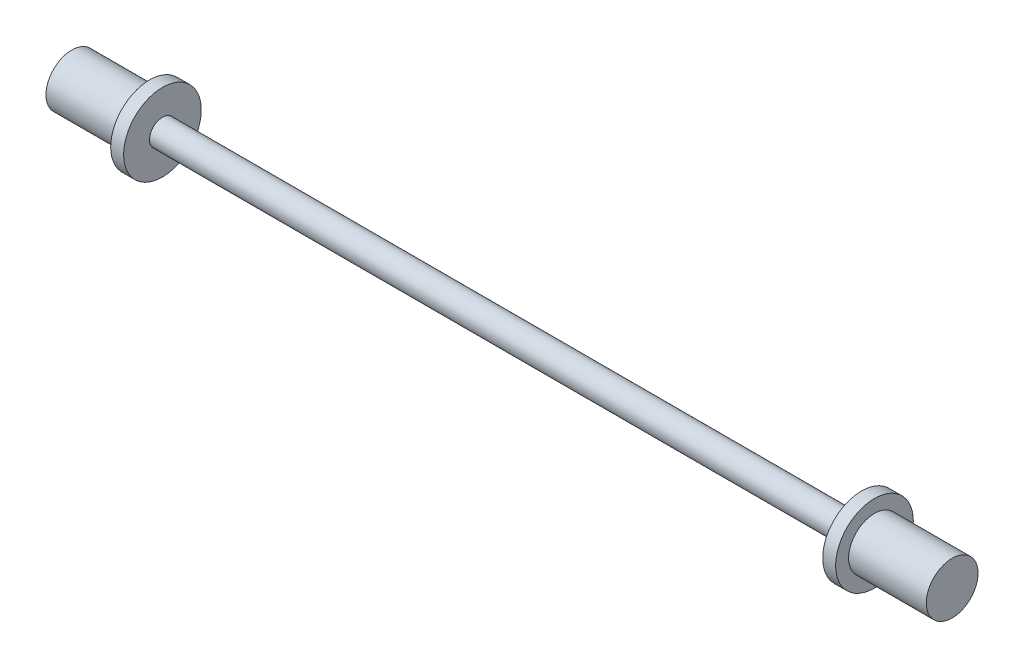
ISO-10303-21;
HEADER;
FILE_DESCRIPTION(('STEP AP214'),'2;1');
FILE_NAME('part.step','',(''),(''),'','','');
FILE_SCHEMA(('AUTOMOTIVE_DESIGN { 1 0 10303 214 1 1 1 1 }'));
ENDSEC;
DATA;
#1=APPLICATION_CONTEXT('core data for automotive mechanical design processes');
#2=APPLICATION_PROTOCOL_DEFINITION('international standard','automotive_design',2000,#1);
#3=PRODUCT_CONTEXT('',#1,'mechanical');
#4=PRODUCT('Part','Part','',(#3));
#5=PRODUCT_RELATED_PRODUCT_CATEGORY('part','',(#4));
#6=PRODUCT_DEFINITION_FORMATION('','',#4);
#7=PRODUCT_DEFINITION_CONTEXT('part definition',#1,'design');
#8=PRODUCT_DEFINITION('design','',#6,#7);
#9=PRODUCT_DEFINITION_SHAPE('','',#8);
#10=(LENGTH_UNIT() NAMED_UNIT(*) SI_UNIT(.MILLI.,.METRE.));
#11=(NAMED_UNIT(*) PLANE_ANGLE_UNIT() SI_UNIT($,.RADIAN.));
#12=(NAMED_UNIT(*) SI_UNIT($,.STERADIAN.) SOLID_ANGLE_UNIT());
#13=UNCERTAINTY_MEASURE_WITH_UNIT(LENGTH_MEASURE(1.E-05),#10,'distance_accuracy_value','');
#14=(GEOMETRIC_REPRESENTATION_CONTEXT(3) GLOBAL_UNCERTAINTY_ASSIGNED_CONTEXT((#13)) GLOBAL_UNIT_ASSIGNED_CONTEXT((#10,
#11,#12)) REPRESENTATION_CONTEXT('',''));
#15=CARTESIAN_POINT('',(0.,0.,0.));
#16=DIRECTION('',(0.,0.,1.));
#17=DIRECTION('',(1.,0.,0.));
#18=AXIS2_PLACEMENT_3D('',#15,#16,#17);
#19=CARTESIAN_POINT('',(-171.45,0.,0.));
#20=DIRECTION('',(1.,0.,0.));
#21=DIRECTION('',(0.,0.,-1.));
#22=AXIS2_PLACEMENT_3D('',#19,#20,#21);
#23=CYLINDRICAL_SURFACE('',#22,6.35);
#24=CARTESIAN_POINT('',(-171.45,0.,0.));
#25=DIRECTION('',(1.,0.,0.));
#26=DIRECTION('',(0.,0.,-1.));
#27=AXIS2_PLACEMENT_3D('',#24,#25,#26);
#28=CIRCLE('',#27,6.35);
#29=CARTESIAN_POINT('',(-171.45,0.,-6.35));
#30=VERTEX_POINT('',#29);
#31=EDGE_CURVE('E39',#30,#30,#28,.T.);
#32=ORIENTED_EDGE('',*,*,#31,.T.);
#33=EDGE_LOOP('',(#32));
#34=FACE_BOUND('',#33,.T.);
#35=CARTESIAN_POINT('',(171.45,0.,0.));
#36=DIRECTION('',(1.,0.,0.));
#37=DIRECTION('',(0.,0.,-1.));
#38=AXIS2_PLACEMENT_3D('',#35,#36,#37);
#39=CIRCLE('',#38,6.35);
#40=CARTESIAN_POINT('',(171.45,0.,-6.35));
#41=VERTEX_POINT('',#40);
#42=EDGE_CURVE('E48',#41,#41,#39,.T.);
#43=ORIENTED_EDGE('',*,*,#42,.F.);
#44=EDGE_LOOP('',(#43));
#45=FACE_BOUND('',#44,.T.);
#46=ADVANCED_FACE('F36',(#34,#45),#23,.T.);
#47=CARTESIAN_POINT('',(177.8,0.,0.));
#48=DIRECTION('',(-1.,0.,0.));
#49=DIRECTION('',(0.,0.,1.));
#50=AXIS2_PLACEMENT_3D('',#47,#48,#49);
#51=CYLINDRICAL_SURFACE('',#50,19.05);
#52=CARTESIAN_POINT('',(177.8,0.,0.));
#53=DIRECTION('',(1.,0.,0.));
#54=DIRECTION('',(0.,0.,-1.));
#55=AXIS2_PLACEMENT_3D('',#52,#53,#54);
#56=CIRCLE('',#55,19.05);
#57=CARTESIAN_POINT('',(177.8,0.,-19.05));
#58=VERTEX_POINT('',#57);
#59=EDGE_CURVE('E62',#58,#58,#56,.T.);
#60=ORIENTED_EDGE('',*,*,#59,.F.);
#61=EDGE_LOOP('',(#60));
#62=FACE_BOUND('',#61,.T.);
#63=CARTESIAN_POINT('',(171.45,0.,0.));
#64=DIRECTION('',(1.,0.,0.));
#65=DIRECTION('',(0.,0.,-1.));
#66=AXIS2_PLACEMENT_3D('',#63,#64,#65);
#67=CIRCLE('',#66,19.05);
#68=CARTESIAN_POINT('',(171.45,0.,-19.05));
#69=VERTEX_POINT('',#68);
#70=EDGE_CURVE('E65',#69,#69,#67,.T.);
#71=ORIENTED_EDGE('',*,*,#70,.T.);
#72=EDGE_LOOP('',(#71));
#73=FACE_BOUND('',#72,.T.);
#74=ADVANCED_FACE('F74',(#62,#73),#51,.T.);
#75=CARTESIAN_POINT('',(177.8,0.,0.));
#76=DIRECTION('',(1.,0.,0.));
#77=DIRECTION('',(0.,0.,-1.));
#78=AXIS2_PLACEMENT_3D('',#75,#76,#77);
#79=PLANE('',#78);
#80=CARTESIAN_POINT('',(177.8,0.,0.));
#81=DIRECTION('',(1.,0.,0.));
#82=DIRECTION('',(0.,0.,-1.));
#83=AXIS2_PLACEMENT_3D('',#80,#81,#82);
#84=CIRCLE('',#83,12.7);
#85=CARTESIAN_POINT('',(177.8,0.,12.7));
#86=VERTEX_POINT('',#85);
#87=EDGE_CURVE('E10',#86,#86,#84,.T.);
#88=ORIENTED_EDGE('',*,*,#87,.F.);
#89=EDGE_LOOP('',(#88));
#90=FACE_BOUND('',#89,.T.);
#91=ORIENTED_EDGE('',*,*,#59,.T.);
#92=EDGE_LOOP('',(#91));
#93=FACE_BOUND('',#92,.T.);
#94=ADVANCED_FACE('F79',(#90,#93),#79,.T.);
#95=CARTESIAN_POINT('',(171.45,0.,0.));
#96=DIRECTION('',(1.,0.,0.));
#97=DIRECTION('',(0.,0.,-1.));
#98=AXIS2_PLACEMENT_3D('',#95,#96,#97);
#99=PLANE('',#98);
#100=ORIENTED_EDGE('',*,*,#42,.T.);
#101=EDGE_LOOP('',(#100));
#102=FACE_BOUND('',#101,.T.);
#103=ORIENTED_EDGE('',*,*,#70,.F.);
#104=EDGE_LOOP('',(#103));
#105=FACE_BOUND('',#104,.T.);
#106=ADVANCED_FACE('F70',(#102,#105),#99,.F.);
#107=CARTESIAN_POINT('',(-177.8,0.,0.));
#108=DIRECTION('',(1.,0.,0.));
#109=DIRECTION('',(0.,0.,-1.));
#110=AXIS2_PLACEMENT_3D('',#107,#108,#109);
#111=CYLINDRICAL_SURFACE('',#110,19.05);
#112=CARTESIAN_POINT('',(-177.8,0.,0.));
#113=DIRECTION('',(-1.,0.,0.));
#114=DIRECTION('',(0.,0.,1.));
#115=AXIS2_PLACEMENT_3D('',#112,#113,#114);
#116=CIRCLE('',#115,19.05);
#117=CARTESIAN_POINT('',(-177.8,0.,19.05));
#118=VERTEX_POINT('',#117);
#119=EDGE_CURVE('E57',#118,#118,#116,.T.);
#120=ORIENTED_EDGE('',*,*,#119,.F.);
#121=EDGE_LOOP('',(#120));
#122=FACE_BOUND('',#121,.T.);
#123=CARTESIAN_POINT('',(-171.45,0.,0.));
#124=DIRECTION('',(-1.,0.,0.));
#125=DIRECTION('',(0.,0.,1.));
#126=AXIS2_PLACEMENT_3D('',#123,#124,#125);
#127=CIRCLE('',#126,19.05);
#128=CARTESIAN_POINT('',(-171.45,0.,19.05));
#129=VERTEX_POINT('',#128);
#130=EDGE_CURVE('E55',#129,#129,#127,.T.);
#131=ORIENTED_EDGE('',*,*,#130,.T.);
#132=EDGE_LOOP('',(#131));
#133=FACE_BOUND('',#132,.T.);
#134=ADVANCED_FACE('F92',(#122,#133),#111,.T.);
#135=CARTESIAN_POINT('',(-177.8,0.,0.));
#136=DIRECTION('',(-1.,0.,0.));
#137=DIRECTION('',(0.,0.,1.));
#138=AXIS2_PLACEMENT_3D('',#135,#136,#137);
#139=PLANE('',#138);
#140=CARTESIAN_POINT('',(-177.8,0.,0.));
#141=DIRECTION('',(-1.,0.,0.));
#142=DIRECTION('',(0.,0.,1.));
#143=AXIS2_PLACEMENT_3D('',#140,#141,#142);
#144=CIRCLE('',#143,12.7);
#145=CARTESIAN_POINT('',(-177.8,0.,-12.7));
#146=VERTEX_POINT('',#145);
#147=EDGE_CURVE('E43',#146,#146,#144,.T.);
#148=ORIENTED_EDGE('',*,*,#147,.F.);
#149=EDGE_LOOP('',(#148));
#150=FACE_BOUND('',#149,.T.);
#151=ORIENTED_EDGE('',*,*,#119,.T.);
#152=EDGE_LOOP('',(#151));
#153=FACE_BOUND('',#152,.T.);
#154=ADVANCED_FACE('F88',(#150,#153),#139,.T.);
#155=CARTESIAN_POINT('',(-171.45,0.,0.));
#156=DIRECTION('',(-1.,0.,0.));
#157=DIRECTION('',(0.,0.,1.));
#158=AXIS2_PLACEMENT_3D('',#155,#156,#157);
#159=PLANE('',#158);
#160=ORIENTED_EDGE('',*,*,#31,.F.);
#161=EDGE_LOOP('',(#160));
#162=FACE_BOUND('',#161,.T.);
#163=ORIENTED_EDGE('',*,*,#130,.F.);
#164=EDGE_LOOP('',(#163));
#165=FACE_BOUND('',#164,.T.);
#166=ADVANCED_FACE('F84',(#162,#165),#159,.F.);
#167=CARTESIAN_POINT('',(-215.9,0.,0.));
#168=DIRECTION('',(1.,0.,0.));
#169=DIRECTION('',(0.,0.,-1.));
#170=AXIS2_PLACEMENT_3D('',#167,#168,#169);
#171=CYLINDRICAL_SURFACE('',#170,12.7);
#172=CARTESIAN_POINT('',(-215.9,0.,0.));
#173=DIRECTION('',(-1.,0.,0.));
#174=DIRECTION('',(0.,0.,1.));
#175=AXIS2_PLACEMENT_3D('',#172,#173,#174);
#176=CIRCLE('',#175,12.7);
#177=CARTESIAN_POINT('',(-215.9,0.,-12.7));
#178=VERTEX_POINT('',#177);
#179=EDGE_CURVE('E53',#178,#178,#176,.T.);
#180=CARTESIAN_POINT('',(-215.9,0.,-12.7));
#181=CARTESIAN_POINT('',(-215.503125,0.,-12.7));
#182=CARTESIAN_POINT('',(-215.10625,0.,-12.7));
#183=CARTESIAN_POINT('',(-214.3125,0.,-12.7));
#184=CARTESIAN_POINT('',(-213.915625,0.,-12.7));
#185=CARTESIAN_POINT('',(-213.121875,0.,-12.7));
#186=CARTESIAN_POINT('',(-212.725,0.,-12.7));
#187=CARTESIAN_POINT('',(-211.93125,0.,-12.7));
#188=CARTESIAN_POINT('',(-211.534375,0.,-12.7));
#189=CARTESIAN_POINT('',(-210.740625,0.,-12.7));
#190=CARTESIAN_POINT('',(-210.34375,0.,-12.7));
#191=CARTESIAN_POINT('',(-209.55,0.,-12.7));
#192=CARTESIAN_POINT('',(-209.153125,0.,-12.7));
#193=CARTESIAN_POINT('',(-208.359375,0.,-12.7));
#194=CARTESIAN_POINT('',(-207.9625,0.,-12.7));
#195=CARTESIAN_POINT('',(-207.16875,0.,-12.7));
#196=CARTESIAN_POINT('',(-206.771875,0.,-12.7));
#197=CARTESIAN_POINT('',(-205.978125,0.,-12.7));
#198=CARTESIAN_POINT('',(-205.58125,0.,-12.7));
#199=CARTESIAN_POINT('',(-204.7875,0.,-12.7));
#200=CARTESIAN_POINT('',(-204.390625,0.,-12.7));
#201=CARTESIAN_POINT('',(-203.596875,0.,-12.7));
#202=CARTESIAN_POINT('',(-203.2,0.,-12.7));
#203=CARTESIAN_POINT('',(-202.40625,0.,-12.7));
#204=CARTESIAN_POINT('',(-202.009375,0.,-12.7));
#205=CARTESIAN_POINT('',(-201.215625,0.,-12.7));
#206=CARTESIAN_POINT('',(-200.81875,0.,-12.7));
#207=CARTESIAN_POINT('',(-200.025,0.,-12.7));
#208=CARTESIAN_POINT('',(-199.628125,0.,-12.7));
#209=CARTESIAN_POINT('',(-198.834375,0.,-12.7));
#210=CARTESIAN_POINT('',(-198.4375,0.,-12.7));
#211=CARTESIAN_POINT('',(-197.64375,0.,-12.7));
#212=CARTESIAN_POINT('',(-197.246875,0.,-12.7));
#213=CARTESIAN_POINT('',(-196.453125,0.,-12.7));
#214=CARTESIAN_POINT('',(-196.05625,0.,-12.7));
#215=CARTESIAN_POINT('',(-195.2625,0.,-12.7));
#216=CARTESIAN_POINT('',(-194.865625,0.,-12.7));
#217=CARTESIAN_POINT('',(-194.071875,0.,-12.7));
#218=CARTESIAN_POINT('',(-193.675,0.,-12.7));
#219=CARTESIAN_POINT('',(-192.88125,0.,-12.7));
#220=CARTESIAN_POINT('',(-192.484375,0.,-12.7));
#221=CARTESIAN_POINT('',(-191.690625,0.,-12.7));
#222=CARTESIAN_POINT('',(-191.29375,0.,-12.7));
#223=CARTESIAN_POINT('',(-190.5,0.,-12.7));
#224=CARTESIAN_POINT('',(-190.103125,0.,-12.7));
#225=CARTESIAN_POINT('',(-189.309375,0.,-12.7));
#226=CARTESIAN_POINT('',(-188.9125,0.,-12.7));
#227=CARTESIAN_POINT('',(-188.11875,0.,-12.7));
#228=CARTESIAN_POINT('',(-187.721875,0.,-12.7));
#229=CARTESIAN_POINT('',(-186.928125,0.,-12.7));
#230=CARTESIAN_POINT('',(-186.53125,0.,-12.7));
#231=CARTESIAN_POINT('',(-185.7375,0.,-12.7));
#232=CARTESIAN_POINT('',(-185.340625,0.,-12.7));
#233=CARTESIAN_POINT('',(-184.546875,0.,-12.7));
#234=CARTESIAN_POINT('',(-184.15,0.,-12.7));
#235=CARTESIAN_POINT('',(-183.35625,0.,-12.7));
#236=CARTESIAN_POINT('',(-182.959375,0.,-12.7));
#237=CARTESIAN_POINT('',(-182.165625,0.,-12.7));
#238=CARTESIAN_POINT('',(-181.76875,0.,-12.7));
#239=CARTESIAN_POINT('',(-180.975,0.,-12.7));
#240=CARTESIAN_POINT('',(-180.578125,0.,-12.7));
#241=CARTESIAN_POINT('',(-179.784375,0.,-12.7));
#242=CARTESIAN_POINT('',(-179.3875,0.,-12.7));
#243=CARTESIAN_POINT('',(-178.59375,0.,-12.7));
#244=CARTESIAN_POINT('',(-178.196875,0.,-12.7));
#245=CARTESIAN_POINT('',(-177.8,0.,-12.7));
#246=B_SPLINE_CURVE_WITH_KNOTS('',3,(#180,#181,#182,#183,#184,#185,#186,#187,#188,#189,#190,
#191,#192,#193,#194,#195,#196,#197,#198,#199,#200,#201,#202,#203,#204,#205,#206,#207,#208,#209,
#210,#211,#212,#213,#214,#215,#216,#217,#218,#219,#220,#221,#222,#223,#224,#225,#226,#227,#228,
#229,#230,#231,#232,#233,#234,#235,#236,#237,#238,#239,#240,#241,#242,#243,#244,#245),
.UNSPECIFIED.,.F.,.F.,(4,2,2,2,2,2,2,2,2,2,2,2,2,2,2,2,2,2,2,2,2,2,2,2,2,2,2,2,2,2,2,2,4),(0.,
1.19062499999997,2.38124999999997,3.57187499999997,4.76249999999998,5.95312499999998,
7.14374999999998,8.33437499999998,9.52499999999998,10.715625,11.90625,13.096875,14.2875,
15.478125,16.66875,17.859375,19.05,20.240625,21.43125,22.621875,23.8125,25.003125,26.19375,
27.384375,28.575,29.765625,30.95625,32.146875,33.3375,34.528125,35.71875,36.909375,38.1),.UNSPECIFIED.);
#247=EDGE_CURVE('BSEAM87',#178,#146,#246,.T.);
#248=ORIENTED_EDGE('',*,*,#179,.F.);
#249=ORIENTED_EDGE('',*,*,#147,.T.);
#250=ORIENTED_EDGE('',*,*,#247,.T.);
#251=ORIENTED_EDGE('',*,*,#247,.F.);
#252=EDGE_LOOP('',(#248,#250,#249,#251));
#253=FACE_BOUND('',#252,.T.);
#254=ADVANCED_FACE('F87',(#253),#171,.T.);
#255=CARTESIAN_POINT('',(-215.9,0.,0.));
#256=DIRECTION('',(-1.,0.,0.));
#257=DIRECTION('',(0.,0.,1.));
#258=AXIS2_PLACEMENT_3D('',#255,#256,#257);
#259=PLANE('',#258);
#260=ORIENTED_EDGE('',*,*,#179,.T.);
#261=EDGE_LOOP('',(#260));
#262=FACE_BOUND('',#261,.T.);
#263=ADVANCED_FACE('F151',(#262),#259,.T.);
#264=CARTESIAN_POINT('',(215.9,0.,0.));
#265=DIRECTION('',(-1.,0.,0.));
#266=DIRECTION('',(0.,0.,1.));
#267=AXIS2_PLACEMENT_3D('',#264,#265,#266);
#268=CYLINDRICAL_SURFACE('',#267,12.7);
#269=CARTESIAN_POINT('',(215.9,0.,0.));
#270=DIRECTION('',(1.,0.,0.));
#271=DIRECTION('',(0.,0.,-1.));
#272=AXIS2_PLACEMENT_3D('',#269,#270,#271);
#273=CIRCLE('',#272,12.7);
#274=CARTESIAN_POINT('',(215.9,0.,12.7));
#275=VERTEX_POINT('',#274);
#276=EDGE_CURVE('E52',#275,#275,#273,.T.);
#277=CARTESIAN_POINT('',(215.9,0.,12.7));
#278=CARTESIAN_POINT('',(215.503125,0.,12.7));
#279=CARTESIAN_POINT('',(215.10625,0.,12.7));
#280=CARTESIAN_POINT('',(214.3125,0.,12.7));
#281=CARTESIAN_POINT('',(213.915625,0.,12.7));
#282=CARTESIAN_POINT('',(213.121875,0.,12.7));
#283=CARTESIAN_POINT('',(212.725,0.,12.7));
#284=CARTESIAN_POINT('',(211.93125,0.,12.7));
#285=CARTESIAN_POINT('',(211.534375,0.,12.7));
#286=CARTESIAN_POINT('',(210.740625,0.,12.7));
#287=CARTESIAN_POINT('',(210.34375,0.,12.7));
#288=CARTESIAN_POINT('',(209.55,0.,12.7));
#289=CARTESIAN_POINT('',(209.153125,0.,12.7));
#290=CARTESIAN_POINT('',(208.359375,0.,12.7));
#291=CARTESIAN_POINT('',(207.9625,0.,12.7));
#292=CARTESIAN_POINT('',(207.16875,0.,12.7));
#293=CARTESIAN_POINT('',(206.771875,0.,12.7));
#294=CARTESIAN_POINT('',(205.978125,0.,12.7));
#295=CARTESIAN_POINT('',(205.58125,0.,12.7));
#296=CARTESIAN_POINT('',(204.7875,0.,12.7));
#297=CARTESIAN_POINT('',(204.390625,0.,12.7));
#298=CARTESIAN_POINT('',(203.596875,0.,12.7));
#299=CARTESIAN_POINT('',(203.2,0.,12.7));
#300=CARTESIAN_POINT('',(202.40625,0.,12.7));
#301=CARTESIAN_POINT('',(202.009375,0.,12.7));
#302=CARTESIAN_POINT('',(201.215625,0.,12.7));
#303=CARTESIAN_POINT('',(200.81875,0.,12.7));
#304=CARTESIAN_POINT('',(200.025,0.,12.7));
#305=CARTESIAN_POINT('',(199.628125,0.,12.7));
#306=CARTESIAN_POINT('',(198.834375,0.,12.7));
#307=CARTESIAN_POINT('',(198.4375,0.,12.7));
#308=CARTESIAN_POINT('',(197.64375,0.,12.7));
#309=CARTESIAN_POINT('',(197.246875,0.,12.7));
#310=CARTESIAN_POINT('',(196.453125,0.,12.7));
#311=CARTESIAN_POINT('',(196.05625,0.,12.7));
#312=CARTESIAN_POINT('',(195.2625,0.,12.7));
#313=CARTESIAN_POINT('',(194.865625,0.,12.7));
#314=CARTESIAN_POINT('',(194.071875,0.,12.7));
#315=CARTESIAN_POINT('',(193.675,0.,12.7));
#316=CARTESIAN_POINT('',(192.88125,0.,12.7));
#317=CARTESIAN_POINT('',(192.484375,0.,12.7));
#318=CARTESIAN_POINT('',(191.690625,0.,12.7));
#319=CARTESIAN_POINT('',(191.29375,0.,12.7));
#320=CARTESIAN_POINT('',(190.5,0.,12.7));
#321=CARTESIAN_POINT('',(190.103125,0.,12.7));
#322=CARTESIAN_POINT('',(189.309375,0.,12.7));
#323=CARTESIAN_POINT('',(188.9125,0.,12.7));
#324=CARTESIAN_POINT('',(188.11875,0.,12.7));
#325=CARTESIAN_POINT('',(187.721875,0.,12.7));
#326=CARTESIAN_POINT('',(186.928125,0.,12.7));
#327=CARTESIAN_POINT('',(186.53125,0.,12.7));
#328=CARTESIAN_POINT('',(185.7375,0.,12.7));
#329=CARTESIAN_POINT('',(185.340625,0.,12.7));
#330=CARTESIAN_POINT('',(184.546875,0.,12.7));
#331=CARTESIAN_POINT('',(184.15,0.,12.7));
#332=CARTESIAN_POINT('',(183.35625,0.,12.7));
#333=CARTESIAN_POINT('',(182.959375,0.,12.7));
#334=CARTESIAN_POINT('',(182.165625,0.,12.7));
#335=CARTESIAN_POINT('',(181.76875,0.,12.7));
#336=CARTESIAN_POINT('',(180.975,0.,12.7));
#337=CARTESIAN_POINT('',(180.578125,0.,12.7));
#338=CARTESIAN_POINT('',(179.784375,0.,12.7));
#339=CARTESIAN_POINT('',(179.3875,0.,12.7));
#340=CARTESIAN_POINT('',(178.59375,0.,12.7));
#341=CARTESIAN_POINT('',(178.196875,0.,12.7));
#342=CARTESIAN_POINT('',(177.8,0.,12.7));
#343=B_SPLINE_CURVE_WITH_KNOTS('',3,(#277,#278,#279,#280,#281,#282,#283,#284,#285,#286,#287,
#288,#289,#290,#291,#292,#293,#294,#295,#296,#297,#298,#299,#300,#301,#302,#303,#304,#305,#306,
#307,#308,#309,#310,#311,#312,#313,#314,#315,#316,#317,#318,#319,#320,#321,#322,#323,#324,#325,
#326,#327,#328,#329,#330,#331,#332,#333,#334,#335,#336,#337,#338,#339,#340,#341,#342),
.UNSPECIFIED.,.F.,.F.,(4,2,2,2,2,2,2,2,2,2,2,2,2,2,2,2,2,2,2,2,2,2,2,2,2,2,2,2,2,2,2,2,4),(0.,
1.19062499999997,2.38124999999997,3.57187499999997,4.76249999999998,5.95312499999998,
7.14374999999998,8.33437499999998,9.52499999999998,10.715625,11.90625,13.096875,14.2875,
15.478125,16.66875,17.859375,19.05,20.240625,21.43125,22.621875,23.8125,25.003125,26.19375,
27.384375,28.575,29.765625,30.95625,32.146875,33.3375,34.528125,35.71875,36.909375,38.1),.UNSPECIFIED.);
#344=EDGE_CURVE('BSEAM161',#275,#86,#343,.T.);
#345=ORIENTED_EDGE('',*,*,#276,.F.);
#346=ORIENTED_EDGE('',*,*,#87,.T.);
#347=ORIENTED_EDGE('',*,*,#344,.T.);
#348=ORIENTED_EDGE('',*,*,#344,.F.);
#349=EDGE_LOOP('',(#345,#347,#346,#348));
#350=FACE_BOUND('',#349,.T.);
#351=ADVANCED_FACE('F161',(#350),#268,.T.);
#352=CARTESIAN_POINT('',(215.9,0.,0.));
#353=DIRECTION('',(1.,0.,0.));
#354=DIRECTION('',(0.,0.,-1.));
#355=AXIS2_PLACEMENT_3D('',#352,#353,#354);
#356=PLANE('',#355);
#357=ORIENTED_EDGE('',*,*,#276,.T.);
#358=EDGE_LOOP('',(#357));
#359=FACE_BOUND('',#358,.T.);
#360=ADVANCED_FACE('F172',(#359),#356,.T.);
#361=CLOSED_SHELL('',(#46,#74,#94,#106,#134,#154,#166,#254,#263,#351,#360));
#362=MANIFOLD_SOLID_BREP('B2',#361);
#363=ADVANCED_BREP_SHAPE_REPRESENTATION('',(#18,#362),#14);
#364=SHAPE_DEFINITION_REPRESENTATION(#9,#363);
ENDSEC;
END-ISO-10303-21;
